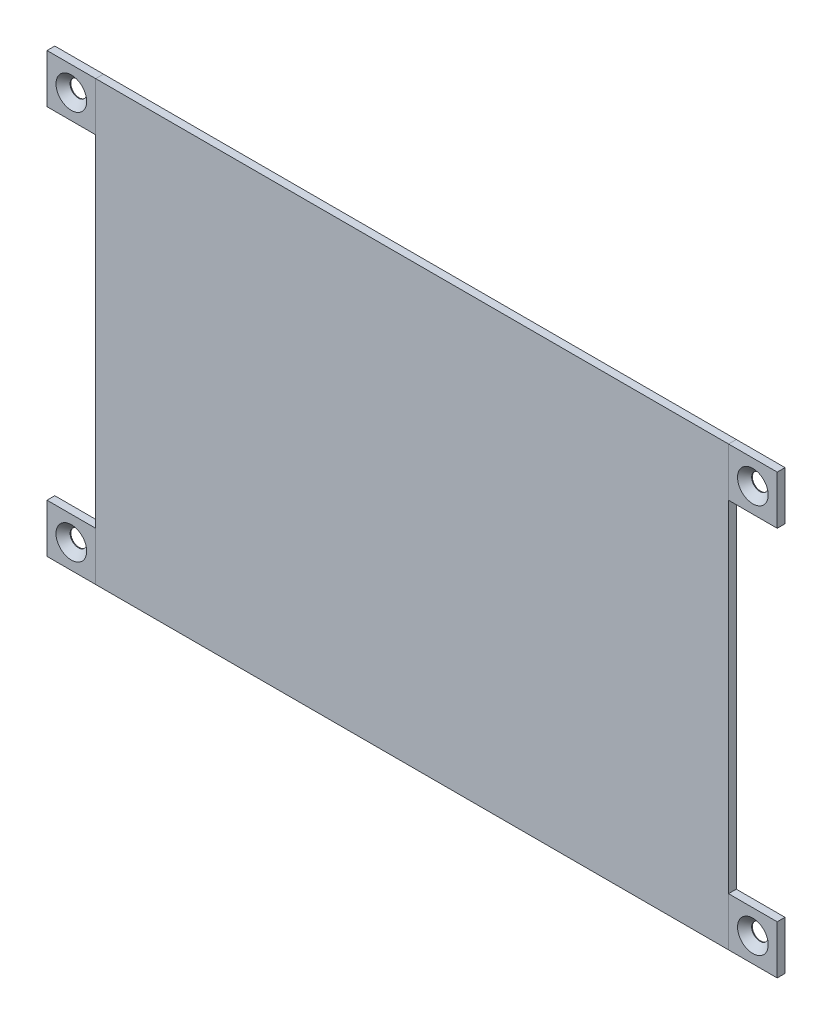
ISO-10303-21;
HEADER;
FILE_DESCRIPTION(('STEP AP214'),'2;1');
FILE_NAME('part.step','',(''),(''),'','','');
FILE_SCHEMA(('AUTOMOTIVE_DESIGN { 1 0 10303 214 1 1 1 1 }'));
ENDSEC;
DATA;
#1=APPLICATION_CONTEXT('core data for automotive mechanical design processes');
#2=APPLICATION_PROTOCOL_DEFINITION('international standard','automotive_design',2000,#1);
#3=PRODUCT_CONTEXT('',#1,'mechanical');
#4=PRODUCT('Part','Part','',(#3));
#5=PRODUCT_RELATED_PRODUCT_CATEGORY('part','',(#4));
#6=PRODUCT_DEFINITION_FORMATION('','',#4);
#7=PRODUCT_DEFINITION_CONTEXT('part definition',#1,'design');
#8=PRODUCT_DEFINITION('design','',#6,#7);
#9=PRODUCT_DEFINITION_SHAPE('','',#8);
#10=(LENGTH_UNIT() NAMED_UNIT(*) SI_UNIT(.MILLI.,.METRE.));
#11=(NAMED_UNIT(*) PLANE_ANGLE_UNIT() SI_UNIT($,.RADIAN.));
#12=(NAMED_UNIT(*) SI_UNIT($,.STERADIAN.) SOLID_ANGLE_UNIT());
#13=UNCERTAINTY_MEASURE_WITH_UNIT(LENGTH_MEASURE(1.E-05),#10,'distance_accuracy_value','');
#14=(GEOMETRIC_REPRESENTATION_CONTEXT(3) GLOBAL_UNCERTAINTY_ASSIGNED_CONTEXT((#13)) GLOBAL_UNIT_ASSIGNED_CONTEXT((#10,
#11,#12)) REPRESENTATION_CONTEXT('',''));
#15=CARTESIAN_POINT('',(0.,0.,0.));
#16=DIRECTION('',(0.,0.,1.));
#17=DIRECTION('',(1.,0.,0.));
#18=AXIS2_PLACEMENT_3D('',#15,#16,#17);
#19=CARTESIAN_POINT('',(0.,90.,1.6));
#20=DIRECTION('',(1.,0.,0.));
#21=DIRECTION('',(0.,1.,0.));
#22=AXIS2_PLACEMENT_3D('',#19,#20,#21);
#23=PLANE('',#22);
#24=DIRECTION('',(0.,-1.,0.));
#25=VECTOR('',#24,1.);
#26=CARTESIAN_POINT('',(0.,90.,0.));
#27=LINE('',#26,#25);
#28=CARTESIAN_POINT('',(0.,90.,0.));
#29=VERTEX_POINT('',#28);
#30=CARTESIAN_POINT('',(0.,80.,0.));
#31=VERTEX_POINT('',#30);
#32=EDGE_CURVE('E12',#29,#31,#27,.T.);
#33=ORIENTED_EDGE('',*,*,#32,.F.);
#34=DIRECTION('',(0.,0.,-1.));
#35=VECTOR('',#34,1.);
#36=CARTESIAN_POINT('',(0.,90.,1.6));
#37=LINE('',#36,#35);
#38=CARTESIAN_POINT('',(0.,90.,1.6));
#39=VERTEX_POINT('',#38);
#40=EDGE_CURVE('E103',#39,#29,#37,.T.);
#41=ORIENTED_EDGE('',*,*,#40,.F.);
#42=DIRECTION('',(0.,-1.,0.));
#43=VECTOR('',#42,1.);
#44=CARTESIAN_POINT('',(0.,90.,1.6));
#45=LINE('',#44,#43);
#46=CARTESIAN_POINT('',(0.,80.,1.6));
#47=VERTEX_POINT('',#46);
#48=EDGE_CURVE('E119',#39,#47,#45,.T.);
#49=ORIENTED_EDGE('',*,*,#48,.T.);
#50=DIRECTION('',(0.,0.,-1.));
#51=VECTOR('',#50,1.);
#52=CARTESIAN_POINT('',(0.,80.,1.6));
#53=LINE('',#52,#51);
#54=EDGE_CURVE('E75',#47,#31,#53,.T.);
#55=ORIENTED_EDGE('',*,*,#54,.T.);
#56=EDGE_LOOP('',(#33,#41,#49,#55));
#57=FACE_BOUND('',#56,.T.);
#58=ADVANCED_FACE('F56',(#57),#23,.T.);
#59=CARTESIAN_POINT('',(0.,90.,1.6));
#60=DIRECTION('',(0.,1.,0.));
#61=DIRECTION('',(-1.,0.,0.));
#62=AXIS2_PLACEMENT_3D('',#59,#60,#61);
#63=PLANE('',#62);
#64=DIRECTION('',(1.,0.,0.));
#65=VECTOR('',#64,1.);
#66=CARTESIAN_POINT('',(0.,90.,0.));
#67=LINE('',#66,#65);
#68=CARTESIAN_POINT('',(-9.99999999999998,90.,0.));
#69=VERTEX_POINT('',#68);
#70=EDGE_CURVE('E116',#69,#29,#67,.T.);
#71=ORIENTED_EDGE('',*,*,#70,.F.);
#72=DIRECTION('',(0.,0.,-1.));
#73=VECTOR('',#72,1.);
#74=CARTESIAN_POINT('',(-9.99999999999998,90.,1.6));
#75=LINE('',#74,#73);
#76=CARTESIAN_POINT('',(-9.99999999999998,90.,1.6));
#77=VERTEX_POINT('',#76);
#78=EDGE_CURVE('E105',#77,#69,#75,.T.);
#79=ORIENTED_EDGE('',*,*,#78,.F.);
#80=DIRECTION('',(1.,0.,0.));
#81=VECTOR('',#80,1.);
#82=CARTESIAN_POINT('',(0.,90.,1.6));
#83=LINE('',#82,#81);
#84=EDGE_CURVE('E125',#77,#39,#83,.T.);
#85=ORIENTED_EDGE('',*,*,#84,.T.);
#86=ORIENTED_EDGE('',*,*,#40,.T.);
#87=EDGE_LOOP('',(#71,#79,#85,#86));
#88=FACE_BOUND('',#87,.T.);
#89=ADVANCED_FACE('F118',(#88),#63,.T.);
#90=CARTESIAN_POINT('',(-9.99999999999998,90.,1.6));
#91=DIRECTION('',(-1.,0.,0.));
#92=DIRECTION('',(0.,-1.,0.));
#93=AXIS2_PLACEMENT_3D('',#90,#91,#92);
#94=PLANE('',#93);
#95=DIRECTION('',(0.,1.,0.));
#96=VECTOR('',#95,1.);
#97=CARTESIAN_POINT('',(-9.99999999999998,90.,0.));
#98=LINE('',#97,#96);
#99=CARTESIAN_POINT('',(-9.99999999999998,80.,0.));
#100=VERTEX_POINT('',#99);
#101=EDGE_CURVE('E108',#100,#69,#98,.T.);
#102=ORIENTED_EDGE('',*,*,#101,.F.);
#103=DIRECTION('',(0.,0.,-1.));
#104=VECTOR('',#103,1.);
#105=CARTESIAN_POINT('',(-9.99999999999998,80.,1.6));
#106=LINE('',#105,#104);
#107=CARTESIAN_POINT('',(-9.99999999999998,80.,1.6));
#108=VERTEX_POINT('',#107);
#109=EDGE_CURVE('E92',#108,#100,#106,.T.);
#110=ORIENTED_EDGE('',*,*,#109,.F.);
#111=DIRECTION('',(0.,1.,0.));
#112=VECTOR('',#111,1.);
#113=CARTESIAN_POINT('',(-9.99999999999998,90.,1.6));
#114=LINE('',#113,#112);
#115=EDGE_CURVE('E110',#108,#77,#114,.T.);
#116=ORIENTED_EDGE('',*,*,#115,.T.);
#117=ORIENTED_EDGE('',*,*,#78,.T.);
#118=EDGE_LOOP('',(#102,#110,#116,#117));
#119=FACE_BOUND('',#118,.T.);
#120=ADVANCED_FACE('F107',(#119),#94,.T.);
#121=CARTESIAN_POINT('',(0.,80.,1.6));
#122=DIRECTION('',(0.,-1.,0.));
#123=DIRECTION('',(0.,0.,-1.));
#124=AXIS2_PLACEMENT_3D('',#121,#122,#123);
#125=PLANE('',#124);
#126=DIRECTION('',(-1.,0.,0.));
#127=VECTOR('',#126,1.);
#128=CARTESIAN_POINT('',(0.,80.,0.));
#129=LINE('',#128,#127);
#130=EDGE_CURVE('E66',#31,#100,#129,.T.);
#131=ORIENTED_EDGE('',*,*,#130,.F.);
#132=ORIENTED_EDGE('',*,*,#54,.F.);
#133=DIRECTION('',(-1.,0.,0.));
#134=VECTOR('',#133,1.);
#135=CARTESIAN_POINT('',(0.,80.,1.6));
#136=LINE('',#135,#134);
#137=EDGE_CURVE('E121',#47,#108,#136,.T.);
#138=ORIENTED_EDGE('',*,*,#137,.T.);
#139=ORIENTED_EDGE('',*,*,#109,.T.);
#140=EDGE_LOOP('',(#131,#132,#138,#139));
#141=FACE_BOUND('',#140,.T.);
#142=ADVANCED_FACE('F128',(#141),#125,.T.);
#143=CARTESIAN_POINT('',(0.,0.,1.6));
#144=DIRECTION('',(0.,0.,-1.));
#145=DIRECTION('',(-1.,0.,0.));
#146=AXIS2_PLACEMENT_3D('',#143,#144,#145);
#147=PLANE('',#146);
#148=CARTESIAN_POINT('',(-4.99999999999999,85.,1.6));
#149=DIRECTION('',(0.,0.,1.));
#150=DIRECTION('',(1.,0.,0.));
#151=AXIS2_PLACEMENT_3D('',#148,#149,#150);
#152=CIRCLE('',#151,3.15);
#153=CARTESIAN_POINT('',(-1.84999999999999,85.,1.6));
#154=VERTEX_POINT('',#153);
#155=EDGE_CURVE('E136',#154,#154,#152,.T.);
#156=ORIENTED_EDGE('',*,*,#155,.F.);
#157=EDGE_LOOP('',(#156));
#158=FACE_BOUND('',#157,.T.);
#159=ORIENTED_EDGE('',*,*,#48,.F.);
#160=ORIENTED_EDGE('',*,*,#84,.F.);
#161=ORIENTED_EDGE('',*,*,#115,.F.);
#162=ORIENTED_EDGE('',*,*,#137,.F.);
#163=EDGE_LOOP('',(#159,#160,#161,#162));
#164=FACE_BOUND('',#163,.T.);
#165=ADVANCED_FACE('F58',(#158,#164),#147,.F.);
#166=CARTESIAN_POINT('',(0.,0.,0.));
#167=DIRECTION('',(0.,0.,-1.));
#168=DIRECTION('',(-1.,0.,0.));
#169=AXIS2_PLACEMENT_3D('',#166,#167,#168);
#170=PLANE('',#169);
#171=CARTESIAN_POINT('',(-4.99999999999999,85.,0.));
#172=DIRECTION('',(0.,0.,-1.));
#173=DIRECTION('',(-1.,0.,0.));
#174=AXIS2_PLACEMENT_3D('',#171,#172,#173);
#175=CIRCLE('',#174,1.69999999999999);
#176=CARTESIAN_POINT('',(-6.69999999999999,85.,0.));
#177=VERTEX_POINT('',#176);
#178=EDGE_CURVE('E60',#177,#177,#175,.T.);
#179=ORIENTED_EDGE('',*,*,#178,.F.);
#180=EDGE_LOOP('',(#179));
#181=FACE_BOUND('',#180,.T.);
#182=ORIENTED_EDGE('',*,*,#32,.T.);
#183=ORIENTED_EDGE('',*,*,#130,.T.);
#184=ORIENTED_EDGE('',*,*,#101,.T.);
#185=ORIENTED_EDGE('',*,*,#70,.T.);
#186=EDGE_LOOP('',(#182,#183,#184,#185));
#187=FACE_BOUND('',#186,.T.);
#188=ADVANCED_FACE('F115',(#181,#187),#170,.T.);
#189=CARTESIAN_POINT('',(-4.99999999999999,85.,1.6));
#190=DIRECTION('',(0.,0.,1.));
#191=DIRECTION('',(1.,0.,0.));
#192=AXIS2_PLACEMENT_3D('',#189,#190,#191);
#193=CYLINDRICAL_SURFACE('',#192,1.69999999999999);
#194=ORIENTED_EDGE('',*,*,#178,.T.);
#195=EDGE_LOOP('',(#194));
#196=FACE_BOUND('',#195,.T.);
#197=CARTESIAN_POINT('',(-4.99999999999999,85.,0.15));
#198=DIRECTION('',(0.,0.,1.));
#199=DIRECTION('',(1.,0.,0.));
#200=AXIS2_PLACEMENT_3D('',#197,#198,#199);
#201=CIRCLE('',#200,1.7);
#202=CARTESIAN_POINT('',(-3.3,85.,0.15));
#203=VERTEX_POINT('',#202);
#204=EDGE_CURVE('E132',#203,#203,#201,.T.);
#205=ORIENTED_EDGE('',*,*,#204,.T.);
#206=EDGE_LOOP('',(#205));
#207=FACE_BOUND('',#206,.T.);
#208=ADVANCED_FACE('F153',(#196,#207),#193,.F.);
#209=CARTESIAN_POINT('',(-4.99999999999999,85.,1.6));
#210=DIRECTION('',(0.,0.,1.));
#211=DIRECTION('',(1.,0.,0.));
#212=AXIS2_PLACEMENT_3D('',#209,#210,#211);
#213=CONICAL_SURFACE('',#212,3.15,0.78539816339745);
#214=ORIENTED_EDGE('',*,*,#204,.F.);
#215=EDGE_LOOP('',(#214));
#216=FACE_BOUND('',#215,.T.);
#217=ORIENTED_EDGE('',*,*,#155,.T.);
#218=EDGE_LOOP('',(#217));
#219=FACE_BOUND('',#218,.T.);
#220=ADVANCED_FACE('F146',(#216,#219),#213,.F.);
#221=CLOSED_SHELL('',(#58,#89,#120,#142,#165,#188,#208,#220));
#222=MANIFOLD_SOLID_BREP('B2',#221);
#223=CARTESIAN_POINT('',(0.,0.,1.6));
#224=DIRECTION('',(1.,0.,0.));
#225=DIRECTION('',(0.,0.,-1.));
#226=AXIS2_PLACEMENT_3D('',#223,#224,#225);
#227=PLANE('',#226);
#228=DIRECTION('',(0.,-1.,0.));
#229=VECTOR('',#228,1.);
#230=CARTESIAN_POINT('',(0.,0.,0.));
#231=LINE('',#230,#229);
#232=CARTESIAN_POINT('',(0.,9.99999999999998,0.));
#233=VERTEX_POINT('',#232);
#234=CARTESIAN_POINT('',(0.,0.,0.));
#235=VERTEX_POINT('',#234);
#236=EDGE_CURVE('E54',#233,#235,#231,.T.);
#237=ORIENTED_EDGE('',*,*,#236,.F.);
#238=DIRECTION('',(0.,0.,-1.));
#239=VECTOR('',#238,1.);
#240=CARTESIAN_POINT('',(0.,9.99999999999998,1.6));
#241=LINE('',#240,#239);
#242=CARTESIAN_POINT('',(0.,9.99999999999998,1.6));
#243=VERTEX_POINT('',#242);
#244=EDGE_CURVE('E273',#243,#233,#241,.T.);
#245=ORIENTED_EDGE('',*,*,#244,.F.);
#246=DIRECTION('',(0.,-1.,0.));
#247=VECTOR('',#246,1.);
#248=CARTESIAN_POINT('',(0.,0.,1.6));
#249=LINE('',#248,#247);
#250=CARTESIAN_POINT('',(0.,0.,1.6));
#251=VERTEX_POINT('',#250);
#252=EDGE_CURVE('E289',#243,#251,#249,.T.);
#253=ORIENTED_EDGE('',*,*,#252,.T.);
#254=DIRECTION('',(0.,0.,-1.));
#255=VECTOR('',#254,1.);
#256=CARTESIAN_POINT('',(0.,0.,1.6));
#257=LINE('',#256,#255);
#258=EDGE_CURVE('E245',#251,#235,#257,.T.);
#259=ORIENTED_EDGE('',*,*,#258,.T.);
#260=EDGE_LOOP('',(#237,#245,#253,#259));
#261=FACE_BOUND('',#260,.T.);
#262=ADVANCED_FACE('F226',(#261),#227,.T.);
#263=CARTESIAN_POINT('',(0.,9.99999999999998,1.6));
#264=DIRECTION('',(0.,1.,0.));
#265=DIRECTION('',(0.,0.,1.));
#266=AXIS2_PLACEMENT_3D('',#263,#264,#265);
#267=PLANE('',#266);
#268=DIRECTION('',(1.,0.,0.));
#269=VECTOR('',#268,1.);
#270=CARTESIAN_POINT('',(0.,9.99999999999998,0.));
#271=LINE('',#270,#269);
#272=CARTESIAN_POINT('',(-9.99999999999998,9.99999999999998,0.));
#273=VERTEX_POINT('',#272);
#274=EDGE_CURVE('E286',#273,#233,#271,.T.);
#275=ORIENTED_EDGE('',*,*,#274,.F.);
#276=DIRECTION('',(0.,0.,-1.));
#277=VECTOR('',#276,1.);
#278=CARTESIAN_POINT('',(-9.99999999999998,9.99999999999998,1.6));
#279=LINE('',#278,#277);
#280=CARTESIAN_POINT('',(-9.99999999999998,9.99999999999998,1.6));
#281=VERTEX_POINT('',#280);
#282=EDGE_CURVE('E275',#281,#273,#279,.T.);
#283=ORIENTED_EDGE('',*,*,#282,.F.);
#284=DIRECTION('',(1.,0.,0.));
#285=VECTOR('',#284,1.);
#286=CARTESIAN_POINT('',(0.,9.99999999999998,1.6));
#287=LINE('',#286,#285);
#288=EDGE_CURVE('E295',#281,#243,#287,.T.);
#289=ORIENTED_EDGE('',*,*,#288,.T.);
#290=ORIENTED_EDGE('',*,*,#244,.T.);
#291=EDGE_LOOP('',(#275,#283,#289,#290));
#292=FACE_BOUND('',#291,.T.);
#293=ADVANCED_FACE('F288',(#292),#267,.T.);
#294=CARTESIAN_POINT('',(-9.99999999999998,0.,1.6));
#295=DIRECTION('',(-1.,0.,0.));
#296=DIRECTION('',(0.,0.,1.));
#297=AXIS2_PLACEMENT_3D('',#294,#295,#296);
#298=PLANE('',#297);
#299=DIRECTION('',(0.,1.,0.));
#300=VECTOR('',#299,1.);
#301=CARTESIAN_POINT('',(-9.99999999999998,0.,0.));
#302=LINE('',#301,#300);
#303=CARTESIAN_POINT('',(-9.99999999999998,0.,0.));
#304=VERTEX_POINT('',#303);
#305=EDGE_CURVE('E278',#304,#273,#302,.T.);
#306=ORIENTED_EDGE('',*,*,#305,.F.);
#307=DIRECTION('',(0.,0.,-1.));
#308=VECTOR('',#307,1.);
#309=CARTESIAN_POINT('',(-9.99999999999998,0.,1.6));
#310=LINE('',#309,#308);
#311=CARTESIAN_POINT('',(-9.99999999999998,0.,1.6));
#312=VERTEX_POINT('',#311);
#313=EDGE_CURVE('E262',#312,#304,#310,.T.);
#314=ORIENTED_EDGE('',*,*,#313,.F.);
#315=DIRECTION('',(0.,1.,0.));
#316=VECTOR('',#315,1.);
#317=CARTESIAN_POINT('',(-9.99999999999998,0.,1.6));
#318=LINE('',#317,#316);
#319=EDGE_CURVE('E280',#312,#281,#318,.T.);
#320=ORIENTED_EDGE('',*,*,#319,.T.);
#321=ORIENTED_EDGE('',*,*,#282,.T.);
#322=EDGE_LOOP('',(#306,#314,#320,#321));
#323=FACE_BOUND('',#322,.T.);
#324=ADVANCED_FACE('F277',(#323),#298,.T.);
#325=CARTESIAN_POINT('',(0.,0.,1.6));
#326=DIRECTION('',(0.,-1.,0.));
#327=DIRECTION('',(0.,0.,-1.));
#328=AXIS2_PLACEMENT_3D('',#325,#326,#327);
#329=PLANE('',#328);
#330=DIRECTION('',(-1.,0.,0.));
#331=VECTOR('',#330,1.);
#332=CARTESIAN_POINT('',(0.,0.,0.));
#333=LINE('',#332,#331);
#334=EDGE_CURVE('E236',#235,#304,#333,.T.);
#335=ORIENTED_EDGE('',*,*,#334,.F.);
#336=ORIENTED_EDGE('',*,*,#258,.F.);
#337=DIRECTION('',(-1.,0.,0.));
#338=VECTOR('',#337,1.);
#339=CARTESIAN_POINT('',(0.,0.,1.6));
#340=LINE('',#339,#338);
#341=EDGE_CURVE('E291',#251,#312,#340,.T.);
#342=ORIENTED_EDGE('',*,*,#341,.T.);
#343=ORIENTED_EDGE('',*,*,#313,.T.);
#344=EDGE_LOOP('',(#335,#336,#342,#343));
#345=FACE_BOUND('',#344,.T.);
#346=ADVANCED_FACE('F298',(#345),#329,.T.);
#347=CARTESIAN_POINT('',(0.,0.,1.6));
#348=DIRECTION('',(0.,0.,1.));
#349=DIRECTION('',(1.,0.,0.));
#350=AXIS2_PLACEMENT_3D('',#347,#348,#349);
#351=PLANE('',#350);
#352=CARTESIAN_POINT('',(-4.99999999999999,4.99999999999999,1.6));
#353=DIRECTION('',(0.,0.,1.));
#354=DIRECTION('',(1.,0.,0.));
#355=AXIS2_PLACEMENT_3D('',#352,#353,#354);
#356=CIRCLE('',#355,3.15);
#357=CARTESIAN_POINT('',(-1.84999999999999,4.99999999999999,1.6));
#358=VERTEX_POINT('',#357);
#359=EDGE_CURVE('E306',#358,#358,#356,.T.);
#360=ORIENTED_EDGE('',*,*,#359,.F.);
#361=EDGE_LOOP('',(#360));
#362=FACE_BOUND('',#361,.T.);
#363=ORIENTED_EDGE('',*,*,#252,.F.);
#364=ORIENTED_EDGE('',*,*,#288,.F.);
#365=ORIENTED_EDGE('',*,*,#319,.F.);
#366=ORIENTED_EDGE('',*,*,#341,.F.);
#367=EDGE_LOOP('',(#363,#364,#365,#366));
#368=FACE_BOUND('',#367,.T.);
#369=ADVANCED_FACE('F228',(#362,#368),#351,.T.);
#370=CARTESIAN_POINT('',(0.,0.,0.));
#371=DIRECTION('',(0.,0.,1.));
#372=DIRECTION('',(1.,0.,0.));
#373=AXIS2_PLACEMENT_3D('',#370,#371,#372);
#374=PLANE('',#373);
#375=CARTESIAN_POINT('',(-4.99999999999999,4.99999999999999,0.));
#376=DIRECTION('',(0.,0.,1.));
#377=DIRECTION('',(1.,0.,0.));
#378=AXIS2_PLACEMENT_3D('',#375,#376,#377);
#379=CIRCLE('',#378,1.69999999999999);
#380=CARTESIAN_POINT('',(-3.3,4.99999999999999,0.));
#381=VERTEX_POINT('',#380);
#382=EDGE_CURVE('E230',#381,#381,#379,.T.);
#383=ORIENTED_EDGE('',*,*,#382,.T.);
#384=EDGE_LOOP('',(#383));
#385=FACE_BOUND('',#384,.T.);
#386=ORIENTED_EDGE('',*,*,#236,.T.);
#387=ORIENTED_EDGE('',*,*,#334,.T.);
#388=ORIENTED_EDGE('',*,*,#305,.T.);
#389=ORIENTED_EDGE('',*,*,#274,.T.);
#390=EDGE_LOOP('',(#386,#387,#388,#389));
#391=FACE_BOUND('',#390,.T.);
#392=ADVANCED_FACE('F285',(#385,#391),#374,.F.);
#393=CARTESIAN_POINT('',(-4.99999999999999,4.99999999999999,1.6));
#394=DIRECTION('',(0.,0.,1.));
#395=DIRECTION('',(1.,0.,0.));
#396=AXIS2_PLACEMENT_3D('',#393,#394,#395);
#397=CYLINDRICAL_SURFACE('',#396,1.69999999999999);
#398=CARTESIAN_POINT('',(-4.99999999999999,4.99999999999999,0.15));
#399=DIRECTION('',(0.,0.,1.));
#400=DIRECTION('',(1.,0.,0.));
#401=AXIS2_PLACEMENT_3D('',#398,#399,#400);
#402=CIRCLE('',#401,1.7);
#403=CARTESIAN_POINT('',(-3.3,4.99999999999999,0.15));
#404=VERTEX_POINT('',#403);
#405=EDGE_CURVE('E302',#404,#404,#402,.T.);
#406=ORIENTED_EDGE('',*,*,#405,.T.);
#407=EDGE_LOOP('',(#406));
#408=FACE_BOUND('',#407,.T.);
#409=ORIENTED_EDGE('',*,*,#382,.F.);
#410=EDGE_LOOP('',(#409));
#411=FACE_BOUND('',#410,.T.);
#412=ADVANCED_FACE('F323',(#408,#411),#397,.F.);
#413=CARTESIAN_POINT('',(-4.99999999999999,4.99999999999999,1.6));
#414=DIRECTION('',(0.,0.,1.));
#415=DIRECTION('',(1.,0.,0.));
#416=AXIS2_PLACEMENT_3D('',#413,#414,#415);
#417=CONICAL_SURFACE('',#416,3.15,0.78539816339745);
#418=ORIENTED_EDGE('',*,*,#405,.F.);
#419=EDGE_LOOP('',(#418));
#420=FACE_BOUND('',#419,.T.);
#421=ORIENTED_EDGE('',*,*,#359,.T.);
#422=EDGE_LOOP('',(#421));
#423=FACE_BOUND('',#422,.T.);
#424=ADVANCED_FACE('F316',(#420,#423),#417,.F.);
#425=CLOSED_SHELL('',(#262,#293,#324,#346,#369,#392,#412,#424));
#426=MANIFOLD_SOLID_BREP('B6',#425);
#427=CARTESIAN_POINT('',(130.,0.,1.6));
#428=DIRECTION('',(-1.,0.,0.));
#429=DIRECTION('',(0.,0.,1.));
#430=AXIS2_PLACEMENT_3D('',#427,#428,#429);
#431=PLANE('',#430);
#432=DIRECTION('',(0.,1.,0.));
#433=VECTOR('',#432,1.);
#434=CARTESIAN_POINT('',(130.,0.,0.));
#435=LINE('',#434,#433);
#436=CARTESIAN_POINT('',(130.,0.,0.));
#437=VERTEX_POINT('',#436);
#438=CARTESIAN_POINT('',(130.,9.99999999999998,0.));
#439=VERTEX_POINT('',#438);
#440=EDGE_CURVE('E224',#437,#439,#435,.T.);
#441=ORIENTED_EDGE('',*,*,#440,.F.);
#442=DIRECTION('',(0.,0.,-1.));
#443=VECTOR('',#442,1.);
#444=CARTESIAN_POINT('',(130.,0.,1.6));
#445=LINE('',#444,#443);
#446=CARTESIAN_POINT('',(130.,0.,1.6));
#447=VERTEX_POINT('',#446);
#448=EDGE_CURVE('E443',#447,#437,#445,.T.);
#449=ORIENTED_EDGE('',*,*,#448,.F.);
#450=DIRECTION('',(0.,1.,0.));
#451=VECTOR('',#450,1.);
#452=CARTESIAN_POINT('',(130.,0.,1.6));
#453=LINE('',#452,#451);
#454=CARTESIAN_POINT('',(130.,9.99999999999998,1.6));
#455=VERTEX_POINT('',#454);
#456=EDGE_CURVE('E459',#447,#455,#453,.T.);
#457=ORIENTED_EDGE('',*,*,#456,.T.);
#458=DIRECTION('',(0.,0.,-1.));
#459=VECTOR('',#458,1.);
#460=CARTESIAN_POINT('',(130.,9.99999999999998,1.6));
#461=LINE('',#460,#459);
#462=EDGE_CURVE('E415',#455,#439,#461,.T.);
#463=ORIENTED_EDGE('',*,*,#462,.T.);
#464=EDGE_LOOP('',(#441,#449,#457,#463));
#465=FACE_BOUND('',#464,.T.);
#466=ADVANCED_FACE('F396',(#465),#431,.T.);
#467=CARTESIAN_POINT('',(130.,0.,1.6));
#468=DIRECTION('',(0.,-1.,0.));
#469=DIRECTION('',(1.,0.,0.));
#470=AXIS2_PLACEMENT_3D('',#467,#468,#469);
#471=PLANE('',#470);
#472=DIRECTION('',(-1.,0.,0.));
#473=VECTOR('',#472,1.);
#474=CARTESIAN_POINT('',(130.,0.,0.));
#475=LINE('',#474,#473);
#476=CARTESIAN_POINT('',(140.,0.,0.));
#477=VERTEX_POINT('',#476);
#478=EDGE_CURVE('E456',#477,#437,#475,.T.);
#479=ORIENTED_EDGE('',*,*,#478,.F.);
#480=DIRECTION('',(0.,0.,-1.));
#481=VECTOR('',#480,1.);
#482=CARTESIAN_POINT('',(140.,0.,1.6));
#483=LINE('',#482,#481);
#484=CARTESIAN_POINT('',(140.,0.,1.6));
#485=VERTEX_POINT('',#484);
#486=EDGE_CURVE('E445',#485,#477,#483,.T.);
#487=ORIENTED_EDGE('',*,*,#486,.F.);
#488=DIRECTION('',(-1.,0.,0.));
#489=VECTOR('',#488,1.);
#490=CARTESIAN_POINT('',(130.,0.,1.6));
#491=LINE('',#490,#489);
#492=EDGE_CURVE('E465',#485,#447,#491,.T.);
#493=ORIENTED_EDGE('',*,*,#492,.T.);
#494=ORIENTED_EDGE('',*,*,#448,.T.);
#495=EDGE_LOOP('',(#479,#487,#493,#494));
#496=FACE_BOUND('',#495,.T.);
#497=ADVANCED_FACE('F458',(#496),#471,.T.);
#498=CARTESIAN_POINT('',(140.,0.,1.6));
#499=DIRECTION('',(1.,0.,0.));
#500=DIRECTION('',(0.,0.,-1.));
#501=AXIS2_PLACEMENT_3D('',#498,#499,#500);
#502=PLANE('',#501);
#503=DIRECTION('',(0.,-1.,0.));
#504=VECTOR('',#503,1.);
#505=CARTESIAN_POINT('',(140.,0.,0.));
#506=LINE('',#505,#504);
#507=CARTESIAN_POINT('',(140.,9.99999999999998,0.));
#508=VERTEX_POINT('',#507);
#509=EDGE_CURVE('E448',#508,#477,#506,.T.);
#510=ORIENTED_EDGE('',*,*,#509,.F.);
#511=DIRECTION('',(0.,0.,-1.));
#512=VECTOR('',#511,1.);
#513=CARTESIAN_POINT('',(140.,9.99999999999998,1.6));
#514=LINE('',#513,#512);
#515=CARTESIAN_POINT('',(140.,9.99999999999998,1.6));
#516=VERTEX_POINT('',#515);
#517=EDGE_CURVE('E432',#516,#508,#514,.T.);
#518=ORIENTED_EDGE('',*,*,#517,.F.);
#519=DIRECTION('',(0.,-1.,0.));
#520=VECTOR('',#519,1.);
#521=CARTESIAN_POINT('',(140.,0.,1.6));
#522=LINE('',#521,#520);
#523=EDGE_CURVE('E450',#516,#485,#522,.T.);
#524=ORIENTED_EDGE('',*,*,#523,.T.);
#525=ORIENTED_EDGE('',*,*,#486,.T.);
#526=EDGE_LOOP('',(#510,#518,#524,#525));
#527=FACE_BOUND('',#526,.T.);
#528=ADVANCED_FACE('F447',(#527),#502,.T.);
#529=CARTESIAN_POINT('',(130.,9.99999999999998,1.6));
#530=DIRECTION('',(0.,1.,0.));
#531=DIRECTION('',(-1.,0.,0.));
#532=AXIS2_PLACEMENT_3D('',#529,#530,#531);
#533=PLANE('',#532);
#534=DIRECTION('',(1.,0.,0.));
#535=VECTOR('',#534,1.);
#536=CARTESIAN_POINT('',(130.,9.99999999999998,0.));
#537=LINE('',#536,#535);
#538=EDGE_CURVE('E406',#439,#508,#537,.T.);
#539=ORIENTED_EDGE('',*,*,#538,.F.);
#540=ORIENTED_EDGE('',*,*,#462,.F.);
#541=DIRECTION('',(1.,0.,0.));
#542=VECTOR('',#541,1.);
#543=CARTESIAN_POINT('',(130.,9.99999999999998,1.6));
#544=LINE('',#543,#542);
#545=EDGE_CURVE('E461',#455,#516,#544,.T.);
#546=ORIENTED_EDGE('',*,*,#545,.T.);
#547=ORIENTED_EDGE('',*,*,#517,.T.);
#548=EDGE_LOOP('',(#539,#540,#546,#547));
#549=FACE_BOUND('',#548,.T.);
#550=ADVANCED_FACE('F468',(#549),#533,.T.);
#551=CARTESIAN_POINT('',(0.,0.,1.6));
#552=DIRECTION('',(0.,0.,-1.));
#553=DIRECTION('',(-1.,0.,0.));
#554=AXIS2_PLACEMENT_3D('',#551,#552,#553);
#555=PLANE('',#554);
#556=CARTESIAN_POINT('',(135.,4.99999999999999,1.6));
#557=DIRECTION('',(0.,0.,1.));
#558=DIRECTION('',(1.,0.,0.));
#559=AXIS2_PLACEMENT_3D('',#556,#557,#558);
#560=CIRCLE('',#559,3.14999999999999);
#561=CARTESIAN_POINT('',(138.15,4.99999999999999,1.6));
#562=VERTEX_POINT('',#561);
#563=EDGE_CURVE('E476',#562,#562,#560,.T.);
#564=ORIENTED_EDGE('',*,*,#563,.F.);
#565=EDGE_LOOP('',(#564));
#566=FACE_BOUND('',#565,.T.);
#567=ORIENTED_EDGE('',*,*,#456,.F.);
#568=ORIENTED_EDGE('',*,*,#492,.F.);
#569=ORIENTED_EDGE('',*,*,#523,.F.);
#570=ORIENTED_EDGE('',*,*,#545,.F.);
#571=EDGE_LOOP('',(#567,#568,#569,#570));
#572=FACE_BOUND('',#571,.T.);
#573=ADVANCED_FACE('F398',(#566,#572),#555,.F.);
#574=CARTESIAN_POINT('',(0.,0.,0.));
#575=DIRECTION('',(0.,0.,-1.));
#576=DIRECTION('',(-1.,0.,0.));
#577=AXIS2_PLACEMENT_3D('',#574,#575,#576);
#578=PLANE('',#577);
#579=CARTESIAN_POINT('',(135.,4.99999999999999,0.));
#580=DIRECTION('',(0.,0.,-1.));
#581=DIRECTION('',(-1.,0.,0.));
#582=AXIS2_PLACEMENT_3D('',#579,#580,#581);
#583=CIRCLE('',#582,1.69999999999999);
#584=CARTESIAN_POINT('',(133.3,4.99999999999999,0.));
#585=VERTEX_POINT('',#584);
#586=EDGE_CURVE('E400',#585,#585,#583,.T.);
#587=ORIENTED_EDGE('',*,*,#586,.F.);
#588=EDGE_LOOP('',(#587));
#589=FACE_BOUND('',#588,.T.);
#590=ORIENTED_EDGE('',*,*,#440,.T.);
#591=ORIENTED_EDGE('',*,*,#538,.T.);
#592=ORIENTED_EDGE('',*,*,#509,.T.);
#593=ORIENTED_EDGE('',*,*,#478,.T.);
#594=EDGE_LOOP('',(#590,#591,#592,#593));
#595=FACE_BOUND('',#594,.T.);
#596=ADVANCED_FACE('F455',(#589,#595),#578,.T.);
#597=CARTESIAN_POINT('',(135.,4.99999999999999,1.6));
#598=DIRECTION('',(0.,0.,1.));
#599=DIRECTION('',(1.,0.,0.));
#600=AXIS2_PLACEMENT_3D('',#597,#598,#599);
#601=CYLINDRICAL_SURFACE('',#600,1.69999999999999);
#602=ORIENTED_EDGE('',*,*,#586,.T.);
#603=EDGE_LOOP('',(#602));
#604=FACE_BOUND('',#603,.T.);
#605=CARTESIAN_POINT('',(135.,4.99999999999999,0.15));
#606=DIRECTION('',(0.,0.,1.));
#607=DIRECTION('',(1.,0.,0.));
#608=AXIS2_PLACEMENT_3D('',#605,#606,#607);
#609=CIRCLE('',#608,1.70000000000001);
#610=CARTESIAN_POINT('',(136.7,4.99999999999999,0.15));
#611=VERTEX_POINT('',#610);
#612=EDGE_CURVE('E472',#611,#611,#609,.T.);
#613=ORIENTED_EDGE('',*,*,#612,.T.);
#614=EDGE_LOOP('',(#613));
#615=FACE_BOUND('',#614,.T.);
#616=ADVANCED_FACE('F493',(#604,#615),#601,.F.);
#617=CARTESIAN_POINT('',(135.,4.99999999999999,1.6));
#618=DIRECTION('',(0.,0.,1.));
#619=DIRECTION('',(1.,0.,0.));
#620=AXIS2_PLACEMENT_3D('',#617,#618,#619);
#621=CONICAL_SURFACE('',#620,3.14999999999999,0.785398163397441);
#622=ORIENTED_EDGE('',*,*,#612,.F.);
#623=EDGE_LOOP('',(#622));
#624=FACE_BOUND('',#623,.T.);
#625=ORIENTED_EDGE('',*,*,#563,.T.);
#626=EDGE_LOOP('',(#625));
#627=FACE_BOUND('',#626,.T.);
#628=ADVANCED_FACE('F486',(#624,#627),#621,.F.);
#629=CLOSED_SHELL('',(#466,#497,#528,#550,#573,#596,#616,#628));
#630=MANIFOLD_SOLID_BREP('B48',#629);
#631=CARTESIAN_POINT('',(130.,90.,1.6));
#632=DIRECTION('',(-1.,0.,0.));
#633=DIRECTION('',(0.,0.,1.));
#634=AXIS2_PLACEMENT_3D('',#631,#632,#633);
#635=PLANE('',#634);
#636=DIRECTION('',(0.,1.,0.));
#637=VECTOR('',#636,1.);
#638=CARTESIAN_POINT('',(130.,90.,0.));
#639=LINE('',#638,#637);
#640=CARTESIAN_POINT('',(130.,80.,0.));
#641=VERTEX_POINT('',#640);
#642=CARTESIAN_POINT('',(130.,90.,0.));
#643=VERTEX_POINT('',#642);
#644=EDGE_CURVE('E632',#641,#643,#639,.T.);
#645=ORIENTED_EDGE('',*,*,#644,.F.);
#646=DIRECTION('',(0.,0.,-1.));
#647=VECTOR('',#646,1.);
#648=CARTESIAN_POINT('',(130.,80.,1.6));
#649=LINE('',#648,#647);
#650=CARTESIAN_POINT('',(130.,80.,1.6));
#651=VERTEX_POINT('',#650);
#652=EDGE_CURVE('E394',#651,#641,#649,.T.);
#653=ORIENTED_EDGE('',*,*,#652,.F.);
#654=DIRECTION('',(0.,1.,0.));
#655=VECTOR('',#654,1.);
#656=CARTESIAN_POINT('',(130.,90.,1.6));
#657=LINE('',#656,#655);
#658=CARTESIAN_POINT('',(130.,90.,1.6));
#659=VERTEX_POINT('',#658);
#660=EDGE_CURVE('E625',#651,#659,#657,.T.);
#661=ORIENTED_EDGE('',*,*,#660,.T.);
#662=DIRECTION('',(0.,0.,-1.));
#663=VECTOR('',#662,1.);
#664=CARTESIAN_POINT('',(130.,90.,1.6));
#665=LINE('',#664,#663);
#666=EDGE_CURVE('E608',#659,#643,#665,.T.);
#667=ORIENTED_EDGE('',*,*,#666,.T.);
#668=EDGE_LOOP('',(#645,#653,#661,#667));
#669=FACE_BOUND('',#668,.T.);
#670=ADVANCED_FACE('F565',(#669),#635,.T.);
#671=CARTESIAN_POINT('',(130.,80.,1.6));
#672=DIRECTION('',(0.,-1.,0.));
#673=DIRECTION('',(0.,0.,-1.));
#674=AXIS2_PLACEMENT_3D('',#671,#672,#673);
#675=PLANE('',#674);
#676=DIRECTION('',(-1.,0.,0.));
#677=VECTOR('',#676,1.);
#678=CARTESIAN_POINT('',(130.,80.,0.));
#679=LINE('',#678,#677);
#680=CARTESIAN_POINT('',(140.,80.,0.));
#681=VERTEX_POINT('',#680);
#682=EDGE_CURVE('E627',#681,#641,#679,.T.);
#683=ORIENTED_EDGE('',*,*,#682,.F.);
#684=DIRECTION('',(0.,0.,-1.));
#685=VECTOR('',#684,1.);
#686=CARTESIAN_POINT('',(140.,80.,1.6));
#687=LINE('',#686,#685);
#688=CARTESIAN_POINT('',(140.,80.,1.6));
#689=VERTEX_POINT('',#688);
#690=EDGE_CURVE('E574',#689,#681,#687,.T.);
#691=ORIENTED_EDGE('',*,*,#690,.F.);
#692=DIRECTION('',(-1.,0.,0.));
#693=VECTOR('',#692,1.);
#694=CARTESIAN_POINT('',(130.,80.,1.6));
#695=LINE('',#694,#693);
#696=EDGE_CURVE('E622',#689,#651,#695,.T.);
#697=ORIENTED_EDGE('',*,*,#696,.T.);
#698=ORIENTED_EDGE('',*,*,#652,.T.);
#699=EDGE_LOOP('',(#683,#691,#697,#698));
#700=FACE_BOUND('',#699,.T.);
#701=ADVANCED_FACE('F642',(#700),#675,.T.);
#702=CARTESIAN_POINT('',(140.,90.,1.6));
#703=DIRECTION('',(1.,0.,0.));
#704=DIRECTION('',(0.,0.,-1.));
#705=AXIS2_PLACEMENT_3D('',#702,#703,#704);
#706=PLANE('',#705);
#707=DIRECTION('',(0.,-1.,0.));
#708=VECTOR('',#707,1.);
#709=CARTESIAN_POINT('',(140.,90.,0.));
#710=LINE('',#709,#708);
#711=CARTESIAN_POINT('',(140.,90.,0.));
#712=VERTEX_POINT('',#711);
#713=EDGE_CURVE('E616',#712,#681,#710,.T.);
#714=ORIENTED_EDGE('',*,*,#713,.F.);
#715=DIRECTION('',(0.,0.,-1.));
#716=VECTOR('',#715,1.);
#717=CARTESIAN_POINT('',(140.,90.,1.6));
#718=LINE('',#717,#716);
#719=CARTESIAN_POINT('',(140.,90.,1.6));
#720=VERTEX_POINT('',#719);
#721=EDGE_CURVE('E611',#720,#712,#718,.T.);
#722=ORIENTED_EDGE('',*,*,#721,.F.);
#723=DIRECTION('',(0.,-1.,0.));
#724=VECTOR('',#723,1.);
#725=CARTESIAN_POINT('',(140.,90.,1.6));
#726=LINE('',#725,#724);
#727=EDGE_CURVE('E614',#720,#689,#726,.T.);
#728=ORIENTED_EDGE('',*,*,#727,.T.);
#729=ORIENTED_EDGE('',*,*,#690,.T.);
#730=EDGE_LOOP('',(#714,#722,#728,#729));
#731=FACE_BOUND('',#730,.T.);
#732=ADVANCED_FACE('F613',(#731),#706,.T.);
#733=CARTESIAN_POINT('',(130.,90.,1.6));
#734=DIRECTION('',(0.,1.,0.));
#735=DIRECTION('',(0.,0.,1.));
#736=AXIS2_PLACEMENT_3D('',#733,#734,#735);
#737=PLANE('',#736);
#738=DIRECTION('',(1.,0.,0.));
#739=VECTOR('',#738,1.);
#740=CARTESIAN_POINT('',(130.,90.,0.));
#741=LINE('',#740,#739);
#742=EDGE_CURVE('E635',#643,#712,#741,.T.);
#743=ORIENTED_EDGE('',*,*,#742,.F.);
#744=ORIENTED_EDGE('',*,*,#666,.F.);
#745=DIRECTION('',(1.,0.,0.));
#746=VECTOR('',#745,1.);
#747=CARTESIAN_POINT('',(130.,90.,1.6));
#748=LINE('',#747,#746);
#749=EDGE_CURVE('E621',#659,#720,#748,.T.);
#750=ORIENTED_EDGE('',*,*,#749,.T.);
#751=ORIENTED_EDGE('',*,*,#721,.T.);
#752=EDGE_LOOP('',(#743,#744,#750,#751));
#753=FACE_BOUND('',#752,.T.);
#754=ADVANCED_FACE('F624',(#753),#737,.T.);
#755=CARTESIAN_POINT('',(0.,0.,1.6));
#756=DIRECTION('',(0.,0.,1.));
#757=DIRECTION('',(1.,0.,0.));
#758=AXIS2_PLACEMENT_3D('',#755,#756,#757);
#759=PLANE('',#758);
#760=CARTESIAN_POINT('',(135.,85.,1.6));
#761=DIRECTION('',(0.,0.,1.));
#762=DIRECTION('',(1.,0.,0.));
#763=AXIS2_PLACEMENT_3D('',#760,#761,#762);
#764=CIRCLE('',#763,3.14999999999999);
#765=CARTESIAN_POINT('',(138.15,85.,1.6));
#766=VERTEX_POINT('',#765);
#767=EDGE_CURVE('E677',#766,#766,#764,.T.);
#768=ORIENTED_EDGE('',*,*,#767,.F.);
#769=EDGE_LOOP('',(#768));
#770=FACE_BOUND('',#769,.T.);
#771=ORIENTED_EDGE('',*,*,#660,.F.);
#772=ORIENTED_EDGE('',*,*,#696,.F.);
#773=ORIENTED_EDGE('',*,*,#727,.F.);
#774=ORIENTED_EDGE('',*,*,#749,.F.);
#775=EDGE_LOOP('',(#771,#772,#773,#774));
#776=FACE_BOUND('',#775,.T.);
#777=ADVANCED_FACE('F620',(#770,#776),#759,.T.);
#778=CARTESIAN_POINT('',(0.,0.,0.));
#779=DIRECTION('',(0.,0.,1.));
#780=DIRECTION('',(1.,0.,0.));
#781=AXIS2_PLACEMENT_3D('',#778,#779,#780);
#782=PLANE('',#781);
#783=CARTESIAN_POINT('',(135.,85.,0.));
#784=DIRECTION('',(0.,0.,1.));
#785=DIRECTION('',(1.,0.,0.));
#786=AXIS2_PLACEMENT_3D('',#783,#784,#785);
#787=CIRCLE('',#786,1.69999999999999);
#788=CARTESIAN_POINT('',(136.7,85.,0.));
#789=VERTEX_POINT('',#788);
#790=EDGE_CURVE('E568',#789,#789,#787,.T.);
#791=ORIENTED_EDGE('',*,*,#790,.T.);
#792=EDGE_LOOP('',(#791));
#793=FACE_BOUND('',#792,.T.);
#794=ORIENTED_EDGE('',*,*,#644,.T.);
#795=ORIENTED_EDGE('',*,*,#742,.T.);
#796=ORIENTED_EDGE('',*,*,#713,.T.);
#797=ORIENTED_EDGE('',*,*,#682,.T.);
#798=EDGE_LOOP('',(#794,#795,#796,#797));
#799=FACE_BOUND('',#798,.T.);
#800=ADVANCED_FACE('F641',(#793,#799),#782,.F.);
#801=CARTESIAN_POINT('',(135.,85.,1.6));
#802=DIRECTION('',(0.,0.,1.));
#803=DIRECTION('',(1.,0.,0.));
#804=AXIS2_PLACEMENT_3D('',#801,#802,#803);
#805=CYLINDRICAL_SURFACE('',#804,1.69999999999999);
#806=CARTESIAN_POINT('',(135.,85.,0.15));
#807=DIRECTION('',(0.,0.,1.));
#808=DIRECTION('',(1.,0.,0.));
#809=AXIS2_PLACEMENT_3D('',#806,#807,#808);
#810=CIRCLE('',#809,1.70000000000001);
#811=CARTESIAN_POINT('',(136.7,85.,0.15));
#812=VERTEX_POINT('',#811);
#813=EDGE_CURVE('E675',#812,#812,#810,.T.);
#814=ORIENTED_EDGE('',*,*,#813,.T.);
#815=EDGE_LOOP('',(#814));
#816=FACE_BOUND('',#815,.T.);
#817=ORIENTED_EDGE('',*,*,#790,.F.);
#818=EDGE_LOOP('',(#817));
#819=FACE_BOUND('',#818,.T.);
#820=ADVANCED_FACE('F660',(#816,#819),#805,.F.);
#821=CARTESIAN_POINT('',(135.,85.,1.6));
#822=DIRECTION('',(0.,0.,1.));
#823=DIRECTION('',(1.,0.,0.));
#824=AXIS2_PLACEMENT_3D('',#821,#822,#823);
#825=CONICAL_SURFACE('',#824,3.14999999999999,0.785398163397441);
#826=ORIENTED_EDGE('',*,*,#813,.F.);
#827=EDGE_LOOP('',(#826));
#828=FACE_BOUND('',#827,.T.);
#829=ORIENTED_EDGE('',*,*,#767,.T.);
#830=EDGE_LOOP('',(#829));
#831=FACE_BOUND('',#830,.T.);
#832=ADVANCED_FACE('F666',(#828,#831),#825,.F.);
#833=CLOSED_SHELL('',(#670,#701,#732,#754,#777,#800,#820,#832));
#834=MANIFOLD_SOLID_BREP('B218',#833);
#835=CARTESIAN_POINT('',(0.,0.,1.6));
#836=DIRECTION('',(1.,0.,0.));
#837=DIRECTION('',(0.,0.,-1.));
#838=AXIS2_PLACEMENT_3D('',#835,#836,#837);
#839=PLANE('',#838);
#840=DIRECTION('',(0.,-1.,0.));
#841=VECTOR('',#840,1.);
#842=CARTESIAN_POINT('',(0.,0.,0.));
#843=LINE('',#842,#841);
#844=CARTESIAN_POINT('',(0.,90.,0.));
#845=VERTEX_POINT('',#844);
#846=CARTESIAN_POINT('',(0.,0.,0.));
#847=VERTEX_POINT('',#846);
#848=EDGE_CURVE('E793',#845,#847,#843,.T.);
#849=ORIENTED_EDGE('',*,*,#848,.T.);
#850=DIRECTION('',(0.,0.,-1.));
#851=VECTOR('',#850,1.);
#852=CARTESIAN_POINT('',(0.,0.,1.6));
#853=LINE('',#852,#851);
#854=CARTESIAN_POINT('',(0.,0.,1.6));
#855=VERTEX_POINT('',#854);
#856=EDGE_CURVE('E563',#855,#847,#853,.T.);
#857=ORIENTED_EDGE('',*,*,#856,.F.);
#858=DIRECTION('',(0.,-1.,0.));
#859=VECTOR('',#858,1.);
#860=CARTESIAN_POINT('',(0.,0.,1.6));
#861=LINE('',#860,#859);
#862=CARTESIAN_POINT('',(0.,90.,1.6));
#863=VERTEX_POINT('',#862);
#864=EDGE_CURVE('E777',#863,#855,#861,.T.);
#865=ORIENTED_EDGE('',*,*,#864,.F.);
#866=DIRECTION('',(0.,0.,-1.));
#867=VECTOR('',#866,1.);
#868=CARTESIAN_POINT('',(0.,90.,1.6));
#869=LINE('',#868,#867);
#870=EDGE_CURVE('E789',#863,#845,#869,.T.);
#871=ORIENTED_EDGE('',*,*,#870,.T.);
#872=EDGE_LOOP('',(#849,#857,#865,#871));
#873=FACE_BOUND('',#872,.T.);
#874=ADVANCED_FACE('F725',(#873),#839,.F.);
#875=CARTESIAN_POINT('',(0.,0.,1.6));
#876=DIRECTION('',(0.,1.,0.));
#877=DIRECTION('',(0.,0.,1.));
#878=AXIS2_PLACEMENT_3D('',#875,#876,#877);
#879=PLANE('',#878);
#880=DIRECTION('',(1.,0.,0.));
#881=VECTOR('',#880,1.);
#882=CARTESIAN_POINT('',(0.,0.,0.));
#883=LINE('',#882,#881);
#884=CARTESIAN_POINT('',(130.,0.,0.));
#885=VERTEX_POINT('',#884);
#886=EDGE_CURVE('E782',#847,#885,#883,.T.);
#887=ORIENTED_EDGE('',*,*,#886,.T.);
#888=DIRECTION('',(0.,0.,-1.));
#889=VECTOR('',#888,1.);
#890=CARTESIAN_POINT('',(130.,0.,1.6));
#891=LINE('',#890,#889);
#892=CARTESIAN_POINT('',(130.,0.,1.6));
#893=VERTEX_POINT('',#892);
#894=EDGE_CURVE('E734',#893,#885,#891,.T.);
#895=ORIENTED_EDGE('',*,*,#894,.F.);
#896=DIRECTION('',(1.,0.,0.));
#897=VECTOR('',#896,1.);
#898=CARTESIAN_POINT('',(0.,0.,1.6));
#899=LINE('',#898,#897);
#900=EDGE_CURVE('E772',#855,#893,#899,.T.);
#901=ORIENTED_EDGE('',*,*,#900,.F.);
#902=ORIENTED_EDGE('',*,*,#856,.T.);
#903=EDGE_LOOP('',(#887,#895,#901,#902));
#904=FACE_BOUND('',#903,.T.);
#905=ADVANCED_FACE('F781',(#904),#879,.F.);
#906=CARTESIAN_POINT('',(130.,0.,1.6));
#907=DIRECTION('',(-1.,0.,0.));
#908=DIRECTION('',(0.,0.,1.));
#909=AXIS2_PLACEMENT_3D('',#906,#907,#908);
#910=PLANE('',#909);
#911=DIRECTION('',(0.,1.,0.));
#912=VECTOR('',#911,1.);
#913=CARTESIAN_POINT('',(130.,0.,0.));
#914=LINE('',#913,#912);
#915=CARTESIAN_POINT('',(130.,90.,0.));
#916=VERTEX_POINT('',#915);
#917=EDGE_CURVE('E759',#885,#916,#914,.T.);
#918=ORIENTED_EDGE('',*,*,#917,.T.);
#919=DIRECTION('',(0.,0.,-1.));
#920=VECTOR('',#919,1.);
#921=CARTESIAN_POINT('',(130.,90.,1.6));
#922=LINE('',#921,#920);
#923=CARTESIAN_POINT('',(130.,90.,1.6));
#924=VERTEX_POINT('',#923);
#925=EDGE_CURVE('E784',#924,#916,#922,.T.);
#926=ORIENTED_EDGE('',*,*,#925,.F.);
#927=DIRECTION('',(0.,1.,0.));
#928=VECTOR('',#927,1.);
#929=CARTESIAN_POINT('',(130.,0.,1.6));
#930=LINE('',#929,#928);
#931=EDGE_CURVE('E775',#893,#924,#930,.T.);
#932=ORIENTED_EDGE('',*,*,#931,.F.);
#933=ORIENTED_EDGE('',*,*,#894,.T.);
#934=EDGE_LOOP('',(#918,#926,#932,#933));
#935=FACE_BOUND('',#934,.T.);
#936=ADVANCED_FACE('F785',(#935),#910,.F.);
#937=CARTESIAN_POINT('',(0.,90.,1.6));
#938=DIRECTION('',(0.,-1.,0.));
#939=DIRECTION('',(0.,0.,-1.));
#940=AXIS2_PLACEMENT_3D('',#937,#938,#939);
#941=PLANE('',#940);
#942=DIRECTION('',(-1.,0.,0.));
#943=VECTOR('',#942,1.);
#944=CARTESIAN_POINT('',(0.,90.,0.));
#945=LINE('',#944,#943);
#946=EDGE_CURVE('E765',#916,#845,#945,.T.);
#947=ORIENTED_EDGE('',*,*,#946,.T.);
#948=ORIENTED_EDGE('',*,*,#870,.F.);
#949=DIRECTION('',(-1.,0.,0.));
#950=VECTOR('',#949,1.);
#951=CARTESIAN_POINT('',(0.,90.,1.6));
#952=LINE('',#951,#950);
#953=EDGE_CURVE('E742',#924,#863,#952,.T.);
#954=ORIENTED_EDGE('',*,*,#953,.F.);
#955=ORIENTED_EDGE('',*,*,#925,.T.);
#956=EDGE_LOOP('',(#947,#948,#954,#955));
#957=FACE_BOUND('',#956,.T.);
#958=ADVANCED_FACE('F806',(#957),#941,.F.);
#959=CARTESIAN_POINT('',(0.,0.,1.6));
#960=DIRECTION('',(0.,0.,-1.));
#961=DIRECTION('',(-1.,0.,0.));
#962=AXIS2_PLACEMENT_3D('',#959,#960,#961);
#963=PLANE('',#962);
#964=ORIENTED_EDGE('',*,*,#864,.T.);
#965=ORIENTED_EDGE('',*,*,#900,.T.);
#966=ORIENTED_EDGE('',*,*,#931,.T.);
#967=ORIENTED_EDGE('',*,*,#953,.T.);
#968=EDGE_LOOP('',(#964,#965,#966,#967));
#969=FACE_BOUND('',#968,.T.);
#970=ADVANCED_FACE('F773',(#969),#963,.F.);
#971=CARTESIAN_POINT('',(0.,0.,0.));
#972=DIRECTION('',(0.,0.,-1.));
#973=DIRECTION('',(-1.,0.,0.));
#974=AXIS2_PLACEMENT_3D('',#971,#972,#973);
#975=PLANE('',#974);
#976=ORIENTED_EDGE('',*,*,#848,.F.);
#977=ORIENTED_EDGE('',*,*,#946,.F.);
#978=ORIENTED_EDGE('',*,*,#917,.F.);
#979=ORIENTED_EDGE('',*,*,#886,.F.);
#980=EDGE_LOOP('',(#976,#977,#978,#979));
#981=FACE_BOUND('',#980,.T.);
#982=ADVANCED_FACE('F809',(#981),#975,.T.);
#983=CLOSED_SHELL('',(#874,#905,#936,#958,#970,#982));
#984=MANIFOLD_SOLID_BREP('B388',#983);
#985=ADVANCED_BREP_SHAPE_REPRESENTATION('',(#18,#222,#426,#630,#834,#984),#14);
#986=SHAPE_DEFINITION_REPRESENTATION(#9,#985);
ENDSEC;
END-ISO-10303-21;
